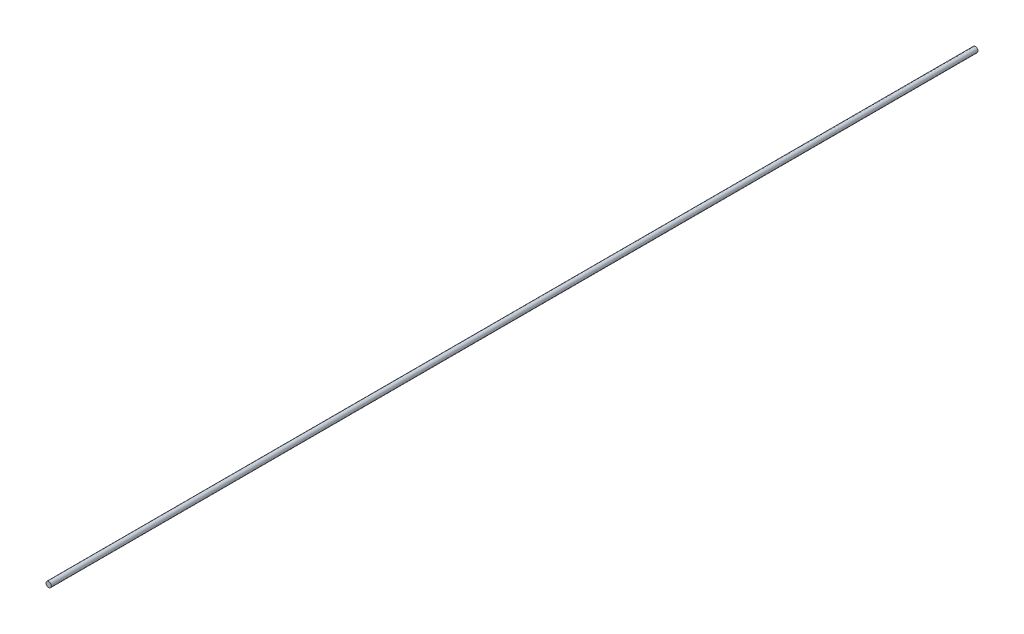
ISO-10303-21;
HEADER;
FILE_DESCRIPTION(('STEP AP214'),'2;1');
FILE_NAME('part.step','',(''),(''),'','','');
FILE_SCHEMA(('AUTOMOTIVE_DESIGN { 1 0 10303 214 1 1 1 1 }'));
ENDSEC;
DATA;
#1=APPLICATION_CONTEXT('core data for automotive mechanical design processes');
#2=APPLICATION_PROTOCOL_DEFINITION('international standard','automotive_design',2000,#1);
#3=PRODUCT_CONTEXT('',#1,'mechanical');
#4=PRODUCT('Part','Part','',(#3));
#5=PRODUCT_RELATED_PRODUCT_CATEGORY('part','',(#4));
#6=PRODUCT_DEFINITION_FORMATION('','',#4);
#7=PRODUCT_DEFINITION_CONTEXT('part definition',#1,'design');
#8=PRODUCT_DEFINITION('design','',#6,#7);
#9=PRODUCT_DEFINITION_SHAPE('','',#8);
#10=(LENGTH_UNIT() NAMED_UNIT(*) SI_UNIT(.MILLI.,.METRE.));
#11=(NAMED_UNIT(*) PLANE_ANGLE_UNIT() SI_UNIT($,.RADIAN.));
#12=(NAMED_UNIT(*) SI_UNIT($,.STERADIAN.) SOLID_ANGLE_UNIT());
#13=UNCERTAINTY_MEASURE_WITH_UNIT(LENGTH_MEASURE(1.E-05),#10,'distance_accuracy_value','');
#14=(GEOMETRIC_REPRESENTATION_CONTEXT(3) GLOBAL_UNCERTAINTY_ASSIGNED_CONTEXT((#13)) GLOBAL_UNIT_ASSIGNED_CONTEXT((#10,
#11,#12)) REPRESENTATION_CONTEXT('',''));
#15=CARTESIAN_POINT('',(0.,0.,0.));
#16=DIRECTION('',(0.,0.,1.));
#17=DIRECTION('',(1.,0.,0.));
#18=AXIS2_PLACEMENT_3D('',#15,#16,#17);
#19=CARTESIAN_POINT('',(0.,0.,140.255436133497));
#20=DIRECTION('',(0.,0.,-1.));
#21=DIRECTION('',(-1.,0.,0.));
#22=AXIS2_PLACEMENT_3D('',#19,#20,#21);
#23=CYLINDRICAL_SURFACE('',#22,0.4);
#24=CARTESIAN_POINT('',(0.,0.,140.255436133497));
#25=DIRECTION('',(0.,0.,1.));
#26=DIRECTION('',(1.,0.,0.));
#27=AXIS2_PLACEMENT_3D('',#24,#25,#26);
#28=CIRCLE('',#27,0.4);
#29=CARTESIAN_POINT('',(0.4,0.,140.255436133497));
#30=VERTEX_POINT('',#29);
#31=EDGE_CURVE('E10',#30,#30,#28,.T.);
#32=ORIENTED_EDGE('',*,*,#31,.F.);
#33=EDGE_LOOP('',(#32));
#34=FACE_BOUND('',#33,.T.);
#35=CARTESIAN_POINT('',(0.,0.,0.));
#36=DIRECTION('',(0.,0.,1.));
#37=DIRECTION('',(1.,0.,0.));
#38=AXIS2_PLACEMENT_3D('',#35,#36,#37);
#39=CIRCLE('',#38,0.4);
#40=CARTESIAN_POINT('',(0.4,0.,0.));
#41=VERTEX_POINT('',#40);
#42=EDGE_CURVE('E44',#41,#41,#39,.T.);
#43=ORIENTED_EDGE('',*,*,#42,.T.);
#44=EDGE_LOOP('',(#43));
#45=FACE_BOUND('',#44,.T.);
#46=ADVANCED_FACE('F41',(#34,#45),#23,.T.);
#47=CARTESIAN_POINT('',(0.,0.,140.255436133497));
#48=DIRECTION('',(0.,0.,1.));
#49=DIRECTION('',(1.,0.,0.));
#50=AXIS2_PLACEMENT_3D('',#47,#48,#49);
#51=PLANE('',#50);
#52=ORIENTED_EDGE('',*,*,#31,.T.);
#53=EDGE_LOOP('',(#52));
#54=FACE_BOUND('',#53,.T.);
#55=ADVANCED_FACE('F58',(#54),#51,.T.);
#56=CARTESIAN_POINT('',(0.,0.,0.));
#57=DIRECTION('',(0.,0.,1.));
#58=DIRECTION('',(1.,0.,0.));
#59=AXIS2_PLACEMENT_3D('',#56,#57,#58);
#60=PLANE('',#59);
#61=ORIENTED_EDGE('',*,*,#42,.F.);
#62=EDGE_LOOP('',(#61));
#63=FACE_BOUND('',#62,.T.);
#64=ADVANCED_FACE('F56',(#63),#60,.F.);
#65=CLOSED_SHELL('',(#46,#55,#64));
#66=MANIFOLD_SOLID_BREP('B2',#65);
#67=ADVANCED_BREP_SHAPE_REPRESENTATION('',(#18,#66),#14);
#68=SHAPE_DEFINITION_REPRESENTATION(#9,#67);
ENDSEC;
END-ISO-10303-21;
